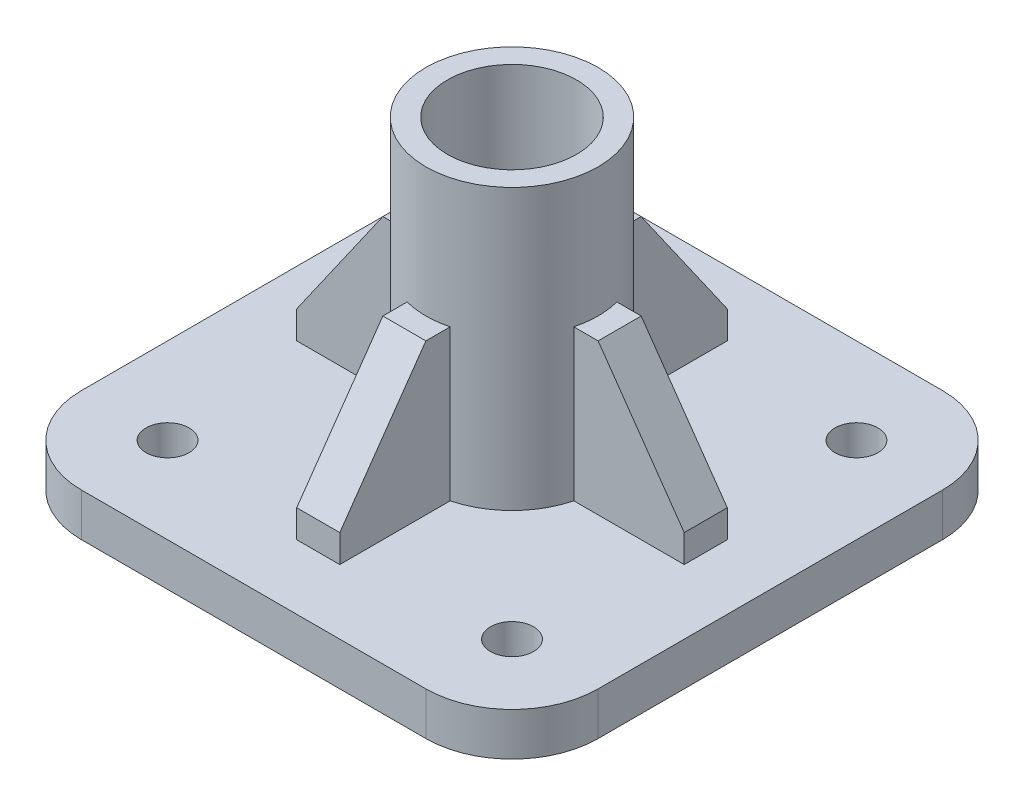
ISO-10303-21;
HEADER;
FILE_DESCRIPTION(('STEP AP214'),'2;1');
FILE_NAME('part.step','',(''),(''),'','','');
FILE_SCHEMA(('AUTOMOTIVE_DESIGN { 1 0 10303 214 1 1 1 1 }'));
ENDSEC;
DATA;
#1=APPLICATION_CONTEXT('core data for automotive mechanical design processes');
#2=APPLICATION_PROTOCOL_DEFINITION('international standard','automotive_design',2000,#1);
#3=PRODUCT_CONTEXT('',#1,'mechanical');
#4=PRODUCT('Part','Part','',(#3));
#5=PRODUCT_RELATED_PRODUCT_CATEGORY('part','',(#4));
#6=PRODUCT_DEFINITION_FORMATION('','',#4);
#7=PRODUCT_DEFINITION_CONTEXT('part definition',#1,'design');
#8=PRODUCT_DEFINITION('design','',#6,#7);
#9=PRODUCT_DEFINITION_SHAPE('','',#8);
#10=(LENGTH_UNIT() NAMED_UNIT(*) SI_UNIT(.MILLI.,.METRE.));
#11=(NAMED_UNIT(*) PLANE_ANGLE_UNIT() SI_UNIT($,.RADIAN.));
#12=(NAMED_UNIT(*) SI_UNIT($,.STERADIAN.) SOLID_ANGLE_UNIT());
#13=UNCERTAINTY_MEASURE_WITH_UNIT(LENGTH_MEASURE(1.E-05),#10,'distance_accuracy_value','');
#14=(GEOMETRIC_REPRESENTATION_CONTEXT(3) GLOBAL_UNCERTAINTY_ASSIGNED_CONTEXT((#13)) GLOBAL_UNIT_ASSIGNED_CONTEXT((#10,
#11,#12)) REPRESENTATION_CONTEXT('',''));
#15=CARTESIAN_POINT('',(0.,0.,0.));
#16=DIRECTION('',(0.,0.,1.));
#17=DIRECTION('',(1.,0.,0.));
#18=AXIS2_PLACEMENT_3D('',#15,#16,#17);
#19=CARTESIAN_POINT('',(60.,10.,-60.));
#20=DIRECTION('',(-1.,0.,0.));
#21=DIRECTION('',(0.,0.,1.));
#22=AXIS2_PLACEMENT_3D('',#19,#20,#21);
#23=PLANE('',#22);
#24=DIRECTION('',(0.,0.,-1.));
#25=VECTOR('',#24,1.);
#26=CARTESIAN_POINT('',(60.,10.,-60.));
#27=LINE('',#26,#25);
#28=CARTESIAN_POINT('',(60.,10.,40.));
#29=VERTEX_POINT('',#28);
#30=CARTESIAN_POINT('',(60.,10.,-40.));
#31=VERTEX_POINT('',#30);
#32=EDGE_CURVE('E305',#29,#31,#27,.T.);
#33=ORIENTED_EDGE('',*,*,#32,.F.);
#34=DIRECTION('',(0.,-1.,0.));
#35=VECTOR('',#34,1.);
#36=CARTESIAN_POINT('',(60.,10.,40.));
#37=LINE('',#36,#35);
#38=CARTESIAN_POINT('',(60.,0.,40.));
#39=VERTEX_POINT('',#38);
#40=EDGE_CURVE('E388',#29,#39,#37,.T.);
#41=ORIENTED_EDGE('',*,*,#40,.T.);
#42=DIRECTION('',(0.,0.,-1.));
#43=VECTOR('',#42,1.);
#44=CARTESIAN_POINT('',(60.,0.,-60.));
#45=LINE('',#44,#43);
#46=CARTESIAN_POINT('',(60.,0.,-40.));
#47=VERTEX_POINT('',#46);
#48=EDGE_CURVE('E298',#39,#47,#45,.T.);
#49=ORIENTED_EDGE('',*,*,#48,.T.);
#50=DIRECTION('',(0.,-1.,0.));
#51=VECTOR('',#50,1.);
#52=CARTESIAN_POINT('',(60.,10.,-40.));
#53=LINE('',#52,#51);
#54=EDGE_CURVE('E386',#47,#31,#53,.F.);
#55=ORIENTED_EDGE('',*,*,#54,.T.);
#56=EDGE_LOOP('',(#33,#41,#49,#55));
#57=FACE_BOUND('',#56,.T.);
#58=ADVANCED_FACE('F36',(#57),#23,.F.);
#59=CARTESIAN_POINT('',(-60.,10.,-60.));
#60=DIRECTION('',(0.,0.,1.));
#61=DIRECTION('',(1.,0.,0.));
#62=AXIS2_PLACEMENT_3D('',#59,#60,#61);
#63=PLANE('',#62);
#64=DIRECTION('',(-1.,0.,0.));
#65=VECTOR('',#64,1.);
#66=CARTESIAN_POINT('',(-60.,10.,-60.));
#67=LINE('',#66,#65);
#68=CARTESIAN_POINT('',(40.,10.,-60.));
#69=VERTEX_POINT('',#68);
#70=CARTESIAN_POINT('',(-40.,10.,-60.));
#71=VERTEX_POINT('',#70);
#72=EDGE_CURVE('E308',#69,#71,#67,.T.);
#73=ORIENTED_EDGE('',*,*,#72,.F.);
#74=DIRECTION('',(0.,-1.,0.));
#75=VECTOR('',#74,1.);
#76=CARTESIAN_POINT('',(40.,10.,-60.));
#77=LINE('',#76,#75);
#78=CARTESIAN_POINT('',(40.,0.,-60.));
#79=VERTEX_POINT('',#78);
#80=EDGE_CURVE('E413',#69,#79,#77,.T.);
#81=ORIENTED_EDGE('',*,*,#80,.T.);
#82=DIRECTION('',(-1.,0.,0.));
#83=VECTOR('',#82,1.);
#84=CARTESIAN_POINT('',(-60.,0.,-60.));
#85=LINE('',#84,#83);
#86=CARTESIAN_POINT('',(-40.,0.,-60.));
#87=VERTEX_POINT('',#86);
#88=EDGE_CURVE('E318',#79,#87,#85,.T.);
#89=ORIENTED_EDGE('',*,*,#88,.T.);
#90=DIRECTION('',(0.,-1.,0.));
#91=VECTOR('',#90,1.);
#92=CARTESIAN_POINT('',(-40.,10.,-60.));
#93=LINE('',#92,#91);
#94=EDGE_CURVE('E411',#87,#71,#93,.F.);
#95=ORIENTED_EDGE('',*,*,#94,.T.);
#96=EDGE_LOOP('',(#73,#81,#89,#95));
#97=FACE_BOUND('',#96,.T.);
#98=ADVANCED_FACE('F446',(#97),#63,.F.);
#99=CARTESIAN_POINT('',(-60.,10.,-60.));
#100=DIRECTION('',(1.,0.,0.));
#101=DIRECTION('',(0.,0.,-1.));
#102=AXIS2_PLACEMENT_3D('',#99,#100,#101);
#103=PLANE('',#102);
#104=DIRECTION('',(0.,0.,1.));
#105=VECTOR('',#104,1.);
#106=CARTESIAN_POINT('',(-60.,0.,-60.));
#107=LINE('',#106,#105);
#108=CARTESIAN_POINT('',(-60.,0.,-40.));
#109=VERTEX_POINT('',#108);
#110=CARTESIAN_POINT('',(-60.,0.,40.));
#111=VERTEX_POINT('',#110);
#112=EDGE_CURVE('E321',#109,#111,#107,.T.);
#113=ORIENTED_EDGE('',*,*,#112,.T.);
#114=DIRECTION('',(0.,-1.,0.));
#115=VECTOR('',#114,1.);
#116=CARTESIAN_POINT('',(-60.,10.,40.));
#117=LINE('',#116,#115);
#118=CARTESIAN_POINT('',(-60.,10.,40.));
#119=VERTEX_POINT('',#118);
#120=EDGE_CURVE('E11',#111,#119,#117,.F.);
#121=ORIENTED_EDGE('',*,*,#120,.T.);
#122=DIRECTION('',(0.,0.,1.));
#123=VECTOR('',#122,1.);
#124=CARTESIAN_POINT('',(-60.,10.,-60.));
#125=LINE('',#124,#123);
#126=CARTESIAN_POINT('',(-60.,10.,-40.));
#127=VERTEX_POINT('',#126);
#128=EDGE_CURVE('E311',#127,#119,#125,.T.);
#129=ORIENTED_EDGE('',*,*,#128,.F.);
#130=DIRECTION('',(0.,-1.,0.));
#131=VECTOR('',#130,1.);
#132=CARTESIAN_POINT('',(-60.,10.,-40.));
#133=LINE('',#132,#131);
#134=EDGE_CURVE('E44',#127,#109,#133,.T.);
#135=ORIENTED_EDGE('',*,*,#134,.T.);
#136=EDGE_LOOP('',(#113,#121,#129,#135));
#137=FACE_BOUND('',#136,.T.);
#138=ADVANCED_FACE('F418',(#137),#103,.F.);
#139=CARTESIAN_POINT('',(-60.,10.,60.));
#140=DIRECTION('',(0.,0.,-1.));
#141=DIRECTION('',(-1.,0.,0.));
#142=AXIS2_PLACEMENT_3D('',#139,#140,#141);
#143=PLANE('',#142);
#144=DIRECTION('',(1.,0.,0.));
#145=VECTOR('',#144,1.);
#146=CARTESIAN_POINT('',(-60.,0.,60.));
#147=LINE('',#146,#145);
#148=CARTESIAN_POINT('',(-40.,0.,60.));
#149=VERTEX_POINT('',#148);
#150=CARTESIAN_POINT('',(40.,0.,60.));
#151=VERTEX_POINT('',#150);
#152=EDGE_CURVE('E309',#149,#151,#147,.T.);
#153=ORIENTED_EDGE('',*,*,#152,.T.);
#154=DIRECTION('',(0.,-1.,0.));
#155=VECTOR('',#154,1.);
#156=CARTESIAN_POINT('',(40.,10.,60.));
#157=LINE('',#156,#155);
#158=CARTESIAN_POINT('',(40.,10.,60.));
#159=VERTEX_POINT('',#158);
#160=EDGE_CURVE('E402',#151,#159,#157,.F.);
#161=ORIENTED_EDGE('',*,*,#160,.T.);
#162=DIRECTION('',(1.,0.,0.));
#163=VECTOR('',#162,1.);
#164=CARTESIAN_POINT('',(-60.,10.,60.));
#165=LINE('',#164,#163);
#166=CARTESIAN_POINT('',(-40.,10.,60.));
#167=VERTEX_POINT('',#166);
#168=EDGE_CURVE('E313',#167,#159,#165,.T.);
#169=ORIENTED_EDGE('',*,*,#168,.F.);
#170=DIRECTION('',(0.,-1.,0.));
#171=VECTOR('',#170,1.);
#172=CARTESIAN_POINT('',(-40.,10.,60.));
#173=LINE('',#172,#171);
#174=EDGE_CURVE('E399',#167,#149,#173,.T.);
#175=ORIENTED_EDGE('',*,*,#174,.T.);
#176=EDGE_LOOP('',(#153,#161,#169,#175));
#177=FACE_BOUND('',#176,.T.);
#178=ADVANCED_FACE('F431',(#177),#143,.F.);
#179=CARTESIAN_POINT('',(60.,10.,60.));
#180=DIRECTION('',(0.,1.,0.));
#181=DIRECTION('',(0.,0.,1.));
#182=AXIS2_PLACEMENT_3D('',#179,#180,#181);
#183=PLANE('',#182);
#184=CARTESIAN_POINT('',(-40.,10.,-40.));
#185=DIRECTION('',(0.,1.,0.));
#186=DIRECTION('',(0.,0.,1.));
#187=AXIS2_PLACEMENT_3D('',#184,#185,#186);
#188=CIRCLE('',#187,5.);
#189=CARTESIAN_POINT('',(-40.,10.,-35.));
#190=VERTEX_POINT('',#189);
#191=EDGE_CURVE('E908',#190,#190,#188,.T.);
#192=ORIENTED_EDGE('',*,*,#191,.F.);
#193=EDGE_LOOP('',(#192));
#194=FACE_BOUND('',#193,.T.);
#195=CARTESIAN_POINT('',(-40.,10.,40.));
#196=DIRECTION('',(0.,1.,0.));
#197=DIRECTION('',(0.,0.,1.));
#198=AXIS2_PLACEMENT_3D('',#195,#196,#197);
#199=CIRCLE('',#198,5.);
#200=CARTESIAN_POINT('',(-40.,10.,45.));
#201=VERTEX_POINT('',#200);
#202=EDGE_CURVE('E902',#201,#201,#199,.T.);
#203=ORIENTED_EDGE('',*,*,#202,.F.);
#204=EDGE_LOOP('',(#203));
#205=FACE_BOUND('',#204,.T.);
#206=CARTESIAN_POINT('',(40.,10.,40.));
#207=DIRECTION('',(0.,1.,0.));
#208=DIRECTION('',(0.,0.,1.));
#209=AXIS2_PLACEMENT_3D('',#206,#207,#208);
#210=CIRCLE('',#209,5.);
#211=CARTESIAN_POINT('',(40.,10.,45.));
#212=VERTEX_POINT('',#211);
#213=EDGE_CURVE('E896',#212,#212,#210,.T.);
#214=ORIENTED_EDGE('',*,*,#213,.F.);
#215=EDGE_LOOP('',(#214));
#216=FACE_BOUND('',#215,.T.);
#217=CARTESIAN_POINT('',(40.,10.,-40.));
#218=DIRECTION('',(0.,1.,0.));
#219=DIRECTION('',(0.,0.,1.));
#220=AXIS2_PLACEMENT_3D('',#217,#218,#219);
#221=CIRCLE('',#220,5.);
#222=CARTESIAN_POINT('',(40.,10.,-35.));
#223=VERTEX_POINT('',#222);
#224=EDGE_CURVE('E890',#223,#223,#221,.T.);
#225=ORIENTED_EDGE('',*,*,#224,.F.);
#226=EDGE_LOOP('',(#225));
#227=FACE_BOUND('',#226,.T.);
#228=DIRECTION('',(0.,0.,1.));
#229=VECTOR('',#228,1.);
#230=CARTESIAN_POINT('',(-5.,10.,0.));
#231=LINE('',#230,#229);
#232=CARTESIAN_POINT('',(-4.99999999999984,9.99999999999999,-45.));
#233=VERTEX_POINT('',#232);
#234=CARTESIAN_POINT('',(-4.99999999999993,10.,-19.3649167310371));
#235=VERTEX_POINT('',#234);
#236=EDGE_CURVE('E266',#233,#235,#231,.T.);
#237=ORIENTED_EDGE('',*,*,#236,.F.);
#238=DIRECTION('',(1.,0.,0.));
#239=VECTOR('',#238,1.);
#240=CARTESIAN_POINT('',(-4.99999999999984,9.99999999999999,-45.));
#241=LINE('',#240,#239);
#242=CARTESIAN_POINT('',(5.00000000000016,9.99999999999999,-45.));
#243=VERTEX_POINT('',#242);
#244=EDGE_CURVE('E268',#233,#243,#241,.T.);
#245=ORIENTED_EDGE('',*,*,#244,.T.);
#246=DIRECTION('',(0.,0.,1.));
#247=VECTOR('',#246,1.);
#248=CARTESIAN_POINT('',(5.,10.,0.));
#249=LINE('',#248,#247);
#250=CARTESIAN_POINT('',(5.00000000000007,10.,-19.3649167310371));
#251=VERTEX_POINT('',#250);
#252=EDGE_CURVE('E273',#243,#251,#249,.T.);
#253=ORIENTED_EDGE('',*,*,#252,.T.);
#254=CARTESIAN_POINT('',(0.,9.99999999999999,0.));
#255=DIRECTION('',(0.,1.,0.));
#256=DIRECTION('',(0.,0.,1.));
#257=AXIS2_PLACEMENT_3D('',#254,#255,#256);
#258=CIRCLE('',#257,20.);
#259=CARTESIAN_POINT('',(19.3649167310371,10.,-5.));
#260=VERTEX_POINT('',#259);
#261=EDGE_CURVE('E249',#260,#251,#258,.T.);
#262=ORIENTED_EDGE('',*,*,#261,.F.);
#263=DIRECTION('',(-1.,0.,0.));
#264=VECTOR('',#263,1.);
#265=CARTESIAN_POINT('',(0.,10.,-5.));
#266=LINE('',#265,#264);
#267=CARTESIAN_POINT('',(45.,9.99999999999999,-5.));
#268=VERTEX_POINT('',#267);
#269=EDGE_CURVE('E225',#268,#260,#266,.T.);
#270=ORIENTED_EDGE('',*,*,#269,.F.);
#271=DIRECTION('',(0.,0.,1.));
#272=VECTOR('',#271,1.);
#273=CARTESIAN_POINT('',(45.,9.99999999999999,-5.));
#274=LINE('',#273,#272);
#275=CARTESIAN_POINT('',(45.,9.99999999999999,5.));
#276=VERTEX_POINT('',#275);
#277=EDGE_CURVE('E235',#268,#276,#274,.T.);
#278=ORIENTED_EDGE('',*,*,#277,.T.);
#279=DIRECTION('',(-1.,0.,0.));
#280=VECTOR('',#279,1.);
#281=CARTESIAN_POINT('',(0.,10.,5.));
#282=LINE('',#281,#280);
#283=CARTESIAN_POINT('',(19.3649167310371,10.,5.));
#284=VERTEX_POINT('',#283);
#285=EDGE_CURVE('E258',#276,#284,#282,.T.);
#286=ORIENTED_EDGE('',*,*,#285,.T.);
#287=CARTESIAN_POINT('',(4.9999999999998,9.99999999999999,19.3649167310371));
#288=VERTEX_POINT('',#287);
#289=EDGE_CURVE('E303',#288,#284,#258,.T.);
#290=ORIENTED_EDGE('',*,*,#289,.F.);
#291=DIRECTION('',(0.,0.,-1.));
#292=VECTOR('',#291,1.);
#293=CARTESIAN_POINT('',(5.,10.,0.));
#294=LINE('',#293,#292);
#295=CARTESIAN_POINT('',(4.99999999999953,10.,45.));
#296=VERTEX_POINT('',#295);
#297=EDGE_CURVE('E835',#296,#288,#294,.T.);
#298=ORIENTED_EDGE('',*,*,#297,.F.);
#299=DIRECTION('',(-1.,0.,0.));
#300=VECTOR('',#299,1.);
#301=CARTESIAN_POINT('',(4.99999999999953,9.99999999999999,45.));
#302=LINE('',#301,#300);
#303=CARTESIAN_POINT('',(-5.00000000000048,10.,44.9999999999999));
#304=VERTEX_POINT('',#303);
#305=EDGE_CURVE('E256',#296,#304,#302,.T.);
#306=ORIENTED_EDGE('',*,*,#305,.T.);
#307=CARTESIAN_POINT('',(-5.00000000000007,9.99999999999999,19.3649167310371));
#308=VERTEX_POINT('',#307);
#309=EDGE_CURVE('E265',#308,#304,#231,.T.);
#310=ORIENTED_EDGE('',*,*,#309,.F.);
#311=CARTESIAN_POINT('',(-19.3649167310371,10.,5.));
#312=VERTEX_POINT('',#311);
#313=EDGE_CURVE('E299',#312,#308,#258,.T.);
#314=ORIENTED_EDGE('',*,*,#313,.F.);
#315=DIRECTION('',(1.,0.,0.));
#316=VECTOR('',#315,1.);
#317=CARTESIAN_POINT('',(0.,10.,5.));
#318=LINE('',#317,#316);
#319=CARTESIAN_POINT('',(-45.,9.99999999999999,5.));
#320=VERTEX_POINT('',#319);
#321=EDGE_CURVE('E284',#320,#312,#318,.T.);
#322=ORIENTED_EDGE('',*,*,#321,.F.);
#323=DIRECTION('',(0.,0.,-1.));
#324=VECTOR('',#323,1.);
#325=CARTESIAN_POINT('',(-45.,9.99999999999999,5.));
#326=LINE('',#325,#324);
#327=CARTESIAN_POINT('',(-45.,9.99999999999999,-5.));
#328=VERTEX_POINT('',#327);
#329=EDGE_CURVE('E286',#320,#328,#326,.T.);
#330=ORIENTED_EDGE('',*,*,#329,.T.);
#331=DIRECTION('',(1.,0.,0.));
#332=VECTOR('',#331,1.);
#333=CARTESIAN_POINT('',(0.,10.,-5.));
#334=LINE('',#333,#332);
#335=CARTESIAN_POINT('',(-19.3649167310371,10.,-5.));
#336=VERTEX_POINT('',#335);
#337=EDGE_CURVE('E282',#328,#336,#334,.T.);
#338=ORIENTED_EDGE('',*,*,#337,.T.);
#339=EDGE_CURVE('E304',#235,#336,#258,.T.);
#340=ORIENTED_EDGE('',*,*,#339,.F.);
#341=EDGE_LOOP('',(#237,#245,#253,#262,#270,#278,#286,#290,#298,#306,#310,#314,#322,#330,#338,#340));
#342=FACE_BOUND('',#341,.T.);
#343=ORIENTED_EDGE('',*,*,#168,.T.);
#344=CARTESIAN_POINT('',(40.,10.,40.));
#345=DIRECTION('',(0.,1.,0.));
#346=DIRECTION('',(0.,0.,1.));
#347=AXIS2_PLACEMENT_3D('',#344,#345,#346);
#348=CIRCLE('',#347,20.);
#349=EDGE_CURVE('E409',#159,#29,#348,.T.);
#350=ORIENTED_EDGE('',*,*,#349,.T.);
#351=ORIENTED_EDGE('',*,*,#32,.T.);
#352=CARTESIAN_POINT('',(40.,10.,-40.));
#353=DIRECTION('',(0.,1.,0.));
#354=DIRECTION('',(0.,0.,1.));
#355=AXIS2_PLACEMENT_3D('',#352,#353,#354);
#356=CIRCLE('',#355,20.);
#357=EDGE_CURVE('E407',#31,#69,#356,.T.);
#358=ORIENTED_EDGE('',*,*,#357,.T.);
#359=ORIENTED_EDGE('',*,*,#72,.T.);
#360=CARTESIAN_POINT('',(-40.,10.,-40.));
#361=DIRECTION('',(0.,1.,0.));
#362=DIRECTION('',(0.,0.,1.));
#363=AXIS2_PLACEMENT_3D('',#360,#361,#362);
#364=CIRCLE('',#363,20.);
#365=EDGE_CURVE('E56',#71,#127,#364,.T.);
#366=ORIENTED_EDGE('',*,*,#365,.T.);
#367=ORIENTED_EDGE('',*,*,#128,.T.);
#368=CARTESIAN_POINT('',(-40.,10.,40.));
#369=DIRECTION('',(0.,1.,0.));
#370=DIRECTION('',(0.,0.,1.));
#371=AXIS2_PLACEMENT_3D('',#368,#369,#370);
#372=CIRCLE('',#371,20.);
#373=EDGE_CURVE('E405',#119,#167,#372,.T.);
#374=ORIENTED_EDGE('',*,*,#373,.T.);
#375=EDGE_LOOP('',(#343,#350,#351,#358,#359,#366,#367,#374));
#376=FACE_BOUND('',#375,.T.);
#377=ADVANCED_FACE('F246',(#194,#205,#216,#227,#342,#376),#183,.T.);
#378=CARTESIAN_POINT('',(60.,0.,60.));
#379=DIRECTION('',(0.,1.,0.));
#380=DIRECTION('',(0.,0.,1.));
#381=AXIS2_PLACEMENT_3D('',#378,#379,#380);
#382=PLANE('',#381);
#383=CARTESIAN_POINT('',(-40.,0.,-40.));
#384=DIRECTION('',(0.,1.,0.));
#385=DIRECTION('',(0.,0.,1.));
#386=AXIS2_PLACEMENT_3D('',#383,#384,#385);
#387=CIRCLE('',#386,5.);
#388=CARTESIAN_POINT('',(-40.,0.,-35.));
#389=VERTEX_POINT('',#388);
#390=EDGE_CURVE('E905',#389,#389,#387,.T.);
#391=ORIENTED_EDGE('',*,*,#390,.T.);
#392=EDGE_LOOP('',(#391));
#393=FACE_BOUND('',#392,.T.);
#394=CARTESIAN_POINT('',(-40.,0.,40.));
#395=DIRECTION('',(0.,1.,0.));
#396=DIRECTION('',(0.,0.,1.));
#397=AXIS2_PLACEMENT_3D('',#394,#395,#396);
#398=CIRCLE('',#397,5.);
#399=CARTESIAN_POINT('',(-40.,0.,45.));
#400=VERTEX_POINT('',#399);
#401=EDGE_CURVE('E899',#400,#400,#398,.T.);
#402=ORIENTED_EDGE('',*,*,#401,.T.);
#403=EDGE_LOOP('',(#402));
#404=FACE_BOUND('',#403,.T.);
#405=CARTESIAN_POINT('',(40.,0.,40.));
#406=DIRECTION('',(0.,1.,0.));
#407=DIRECTION('',(0.,0.,1.));
#408=AXIS2_PLACEMENT_3D('',#405,#406,#407);
#409=CIRCLE('',#408,5.);
#410=CARTESIAN_POINT('',(40.,0.,45.));
#411=VERTEX_POINT('',#410);
#412=EDGE_CURVE('E893',#411,#411,#409,.T.);
#413=ORIENTED_EDGE('',*,*,#412,.T.);
#414=EDGE_LOOP('',(#413));
#415=FACE_BOUND('',#414,.T.);
#416=CARTESIAN_POINT('',(40.,0.,-40.));
#417=DIRECTION('',(0.,1.,0.));
#418=DIRECTION('',(0.,0.,1.));
#419=AXIS2_PLACEMENT_3D('',#416,#417,#418);
#420=CIRCLE('',#419,5.);
#421=CARTESIAN_POINT('',(40.,0.,-35.));
#422=VERTEX_POINT('',#421);
#423=EDGE_CURVE('E886',#422,#422,#420,.T.);
#424=ORIENTED_EDGE('',*,*,#423,.T.);
#425=EDGE_LOOP('',(#424));
#426=FACE_BOUND('',#425,.T.);
#427=CARTESIAN_POINT('',(0.,0.,0.));
#428=DIRECTION('',(0.,1.,0.));
#429=DIRECTION('',(0.,0.,1.));
#430=AXIS2_PLACEMENT_3D('',#427,#428,#429);
#431=CIRCLE('',#430,15.);
#432=CARTESIAN_POINT('',(0.,0.,15.));
#433=VERTEX_POINT('',#432);
#434=EDGE_CURVE('E843',#433,#433,#431,.T.);
#435=ORIENTED_EDGE('',*,*,#434,.T.);
#436=EDGE_LOOP('',(#435));
#437=FACE_BOUND('',#436,.T.);
#438=ORIENTED_EDGE('',*,*,#48,.F.);
#439=CARTESIAN_POINT('',(40.,0.,40.));
#440=DIRECTION('',(0.,1.,0.));
#441=DIRECTION('',(0.,0.,1.));
#442=AXIS2_PLACEMENT_3D('',#439,#440,#441);
#443=CIRCLE('',#442,20.);
#444=EDGE_CURVE('E397',#39,#151,#443,.F.);
#445=ORIENTED_EDGE('',*,*,#444,.T.);
#446=ORIENTED_EDGE('',*,*,#152,.F.);
#447=CARTESIAN_POINT('',(-40.,0.,40.));
#448=DIRECTION('',(0.,1.,0.));
#449=DIRECTION('',(0.,0.,1.));
#450=AXIS2_PLACEMENT_3D('',#447,#448,#449);
#451=CIRCLE('',#450,20.);
#452=EDGE_CURVE('E393',#149,#111,#451,.F.);
#453=ORIENTED_EDGE('',*,*,#452,.T.);
#454=ORIENTED_EDGE('',*,*,#112,.F.);
#455=CARTESIAN_POINT('',(-40.,0.,-40.));
#456=DIRECTION('',(0.,1.,0.));
#457=DIRECTION('',(0.,0.,1.));
#458=AXIS2_PLACEMENT_3D('',#455,#456,#457);
#459=CIRCLE('',#458,20.);
#460=EDGE_CURVE('E391',#109,#87,#459,.F.);
#461=ORIENTED_EDGE('',*,*,#460,.T.);
#462=ORIENTED_EDGE('',*,*,#88,.F.);
#463=CARTESIAN_POINT('',(40.,0.,-40.));
#464=DIRECTION('',(0.,1.,0.));
#465=DIRECTION('',(0.,0.,1.));
#466=AXIS2_PLACEMENT_3D('',#463,#464,#465);
#467=CIRCLE('',#466,20.);
#468=EDGE_CURVE('E395',#79,#47,#467,.F.);
#469=ORIENTED_EDGE('',*,*,#468,.T.);
#470=EDGE_LOOP('',(#438,#445,#446,#453,#454,#461,#462,#469));
#471=FACE_BOUND('',#470,.T.);
#472=ADVANCED_FACE('F422',(#393,#404,#415,#426,#437,#471),#382,.F.);
#473=CARTESIAN_POINT('',(0.,75.,0.));
#474=DIRECTION('',(0.,-1.,0.));
#475=DIRECTION('',(0.,0.,-1.));
#476=AXIS2_PLACEMENT_3D('',#473,#474,#475);
#477=CYLINDRICAL_SURFACE('',#476,20.);
#478=DIRECTION('',(0.,-1.,0.));
#479=VECTOR('',#478,1.);
#480=CARTESIAN_POINT('',(-4.99999999999993,75.,-19.3649167310371));
#481=LINE('',#480,#479);
#482=CARTESIAN_POINT('',(-4.99999999999993,45.,-19.3649167310371));
#483=VERTEX_POINT('',#482);
#484=EDGE_CURVE('E359',#235,#483,#481,.F.);
#485=ORIENTED_EDGE('',*,*,#484,.F.);
#486=ORIENTED_EDGE('',*,*,#339,.T.);
#487=DIRECTION('',(0.,-1.,0.));
#488=VECTOR('',#487,1.);
#489=CARTESIAN_POINT('',(-19.3649167310371,75.,-5.));
#490=LINE('',#489,#488);
#491=CARTESIAN_POINT('',(-19.3649167310371,45.,-5.));
#492=VERTEX_POINT('',#491);
#493=EDGE_CURVE('E302',#336,#492,#490,.F.);
#494=ORIENTED_EDGE('',*,*,#493,.T.);
#495=CARTESIAN_POINT('',(0.,45.,0.));
#496=DIRECTION('',(0.,-1.,0.));
#497=DIRECTION('',(0.,0.,-1.));
#498=AXIS2_PLACEMENT_3D('',#495,#496,#497);
#499=CIRCLE('',#498,20.);
#500=CARTESIAN_POINT('',(-19.3649167310371,45.,5.));
#501=VERTEX_POINT('',#500);
#502=EDGE_CURVE('E327',#492,#501,#499,.F.);
#503=ORIENTED_EDGE('',*,*,#502,.T.);
#504=DIRECTION('',(0.,-1.,0.));
#505=VECTOR('',#504,1.);
#506=CARTESIAN_POINT('',(-19.3649167310371,75.,5.));
#507=LINE('',#506,#505);
#508=EDGE_CURVE('E330',#312,#501,#507,.F.);
#509=ORIENTED_EDGE('',*,*,#508,.F.);
#510=ORIENTED_EDGE('',*,*,#313,.T.);
#511=DIRECTION('',(0.,-1.,0.));
#512=VECTOR('',#511,1.);
#513=CARTESIAN_POINT('',(-5.00000000000007,75.,19.3649167310371));
#514=LINE('',#513,#512);
#515=CARTESIAN_POINT('',(-5.00000000000007,45.,19.3649167310371));
#516=VERTEX_POINT('',#515);
#517=EDGE_CURVE('E346',#516,#308,#514,.T.);
#518=ORIENTED_EDGE('',*,*,#517,.F.);
#519=CARTESIAN_POINT('',(0.,45.,0.));
#520=DIRECTION('',(0.,-1.,0.));
#521=DIRECTION('',(0.,0.,-1.));
#522=AXIS2_PLACEMENT_3D('',#519,#520,#521);
#523=CIRCLE('',#522,20.);
#524=CARTESIAN_POINT('',(4.9999999999998,45.,19.3649167310371));
#525=VERTEX_POINT('',#524);
#526=EDGE_CURVE('E344',#516,#525,#523,.F.);
#527=ORIENTED_EDGE('',*,*,#526,.T.);
#528=DIRECTION('',(0.,-1.,0.));
#529=VECTOR('',#528,1.);
#530=CARTESIAN_POINT('',(4.9999999999998,75.,19.3649167310371));
#531=LINE('',#530,#529);
#532=EDGE_CURVE('E341',#288,#525,#531,.F.);
#533=ORIENTED_EDGE('',*,*,#532,.F.);
#534=ORIENTED_EDGE('',*,*,#289,.T.);
#535=DIRECTION('',(0.,-1.,0.));
#536=VECTOR('',#535,1.);
#537=CARTESIAN_POINT('',(19.3649167310371,75.,5.));
#538=LINE('',#537,#536);
#539=CARTESIAN_POINT('',(19.3649167310371,45.,5.));
#540=VERTEX_POINT('',#539);
#541=EDGE_CURVE('E351',#284,#540,#538,.F.);
#542=ORIENTED_EDGE('',*,*,#541,.T.);
#543=CARTESIAN_POINT('',(19.3649167310371,45.,-5.));
#544=VERTEX_POINT('',#543);
#545=EDGE_CURVE('E348',#540,#544,#523,.F.);
#546=ORIENTED_EDGE('',*,*,#545,.T.);
#547=DIRECTION('',(0.,-1.,0.));
#548=VECTOR('',#547,1.);
#549=CARTESIAN_POINT('',(19.3649167310371,75.,-5.));
#550=LINE('',#549,#548);
#551=EDGE_CURVE('E354',#260,#544,#550,.F.);
#552=ORIENTED_EDGE('',*,*,#551,.F.);
#553=ORIENTED_EDGE('',*,*,#261,.T.);
#554=DIRECTION('',(0.,-1.,0.));
#555=VECTOR('',#554,1.);
#556=CARTESIAN_POINT('',(5.00000000000007,75.,-19.3649167310371));
#557=LINE('',#556,#555);
#558=CARTESIAN_POINT('',(5.00000000000007,45.,-19.3649167310371));
#559=VERTEX_POINT('',#558);
#560=EDGE_CURVE('E356',#251,#559,#557,.F.);
#561=ORIENTED_EDGE('',*,*,#560,.T.);
#562=EDGE_CURVE('E347',#559,#483,#523,.F.);
#563=ORIENTED_EDGE('',*,*,#562,.T.);
#564=EDGE_LOOP('',(#485,#486,#494,#503,#509,#510,#518,#527,#533,#534,#542,#546,#552,#553,#561,#563));
#565=FACE_BOUND('',#564,.T.);
#566=CARTESIAN_POINT('',(0.,75.,0.));
#567=DIRECTION('',(0.,-1.,0.));
#568=DIRECTION('',(0.,0.,-1.));
#569=AXIS2_PLACEMENT_3D('',#566,#567,#568);
#570=CIRCLE('',#569,20.);
#571=CARTESIAN_POINT('',(0.,75.,-20.));
#572=VERTEX_POINT('',#571);
#573=EDGE_CURVE('E295',#572,#572,#570,.T.);
#574=ORIENTED_EDGE('',*,*,#573,.T.);
#575=EDGE_LOOP('',(#574));
#576=FACE_BOUND('',#575,.T.);
#577=ADVANCED_FACE('F522',(#565,#576),#477,.T.);
#578=CARTESIAN_POINT('',(0.,75.,0.));
#579=DIRECTION('',(0.,-1.,0.));
#580=DIRECTION('',(0.,0.,-1.));
#581=AXIS2_PLACEMENT_3D('',#578,#579,#580);
#582=PLANE('',#581);
#583=CARTESIAN_POINT('',(0.,75.,0.));
#584=DIRECTION('',(0.,1.,0.));
#585=DIRECTION('',(0.,0.,1.));
#586=AXIS2_PLACEMENT_3D('',#583,#584,#585);
#587=CIRCLE('',#586,15.);
#588=CARTESIAN_POINT('',(0.,75.,15.));
#589=VERTEX_POINT('',#588);
#590=EDGE_CURVE('E881',#589,#589,#587,.T.);
#591=ORIENTED_EDGE('',*,*,#590,.F.);
#592=EDGE_LOOP('',(#591));
#593=FACE_BOUND('',#592,.T.);
#594=ORIENTED_EDGE('',*,*,#573,.F.);
#595=EDGE_LOOP('',(#594));
#596=FACE_BOUND('',#595,.T.);
#597=ADVANCED_FACE('F615',(#593,#596),#582,.F.);
#598=CARTESIAN_POINT('',(0.,45.,5.));
#599=DIRECTION('',(0.,-1.,0.));
#600=DIRECTION('',(0.,0.,-1.));
#601=AXIS2_PLACEMENT_3D('',#598,#599,#600);
#602=PLANE('',#601);
#603=DIRECTION('',(-1.,0.,0.));
#604=VECTOR('',#603,1.);
#605=CARTESIAN_POINT('',(0.,45.,-5.));
#606=LINE('',#605,#604);
#607=CARTESIAN_POINT('',(-24.9999999999999,45.,-5.));
#608=VERTEX_POINT('',#607);
#609=EDGE_CURVE('E277',#492,#608,#606,.T.);
#610=ORIENTED_EDGE('',*,*,#609,.T.);
#611=DIRECTION('',(0.,0.,1.));
#612=VECTOR('',#611,1.);
#613=CARTESIAN_POINT('',(-25.,45.,5.));
#614=LINE('',#613,#612);
#615=CARTESIAN_POINT('',(-25.,45.,5.));
#616=VERTEX_POINT('',#615);
#617=EDGE_CURVE('E337',#608,#616,#614,.T.);
#618=ORIENTED_EDGE('',*,*,#617,.T.);
#619=DIRECTION('',(-1.,0.,0.));
#620=VECTOR('',#619,1.);
#621=CARTESIAN_POINT('',(0.,45.,5.));
#622=LINE('',#621,#620);
#623=EDGE_CURVE('E278',#501,#616,#622,.T.);
#624=ORIENTED_EDGE('',*,*,#623,.F.);
#625=ORIENTED_EDGE('',*,*,#502,.F.);
#626=EDGE_LOOP('',(#610,#618,#624,#625));
#627=FACE_BOUND('',#626,.T.);
#628=ADVANCED_FACE('F611',(#627),#602,.F.);
#629=CARTESIAN_POINT('',(-45.,9.99999999999999,5.));
#630=DIRECTION('',(1.,0.,0.));
#631=DIRECTION('',(0.,0.,-1.));
#632=AXIS2_PLACEMENT_3D('',#629,#630,#631);
#633=PLANE('',#632);
#634=DIRECTION('',(0.,-1.,0.));
#635=VECTOR('',#634,1.);
#636=CARTESIAN_POINT('',(-45.,9.99999999999999,5.));
#637=LINE('',#636,#635);
#638=CARTESIAN_POINT('',(-45.,16.4370398651577,5.));
#639=VERTEX_POINT('',#638);
#640=EDGE_CURVE('E281',#639,#320,#637,.T.);
#641=ORIENTED_EDGE('',*,*,#640,.F.);
#642=DIRECTION('',(0.,0.,-1.));
#643=VECTOR('',#642,1.);
#644=CARTESIAN_POINT('',(-45.,16.4370398651578,5.));
#645=LINE('',#644,#643);
#646=CARTESIAN_POINT('',(-45.,16.4370398651577,-5.));
#647=VERTEX_POINT('',#646);
#648=EDGE_CURVE('E332',#639,#647,#645,.T.);
#649=ORIENTED_EDGE('',*,*,#648,.T.);
#650=DIRECTION('',(0.,-1.,0.));
#651=VECTOR('',#650,1.);
#652=CARTESIAN_POINT('',(-45.,9.99999999999999,-5.));
#653=LINE('',#652,#651);
#654=EDGE_CURVE('E289',#647,#328,#653,.T.);
#655=ORIENTED_EDGE('',*,*,#654,.T.);
#656=ORIENTED_EDGE('',*,*,#329,.F.);
#657=EDGE_LOOP('',(#641,#649,#655,#656));
#658=FACE_BOUND('',#657,.T.);
#659=ADVANCED_FACE('F604',(#658),#633,.F.);
#660=CARTESIAN_POINT('',(0.,45.,5.));
#661=DIRECTION('',(0.,0.,1.));
#662=DIRECTION('',(1.,0.,0.));
#663=AXIS2_PLACEMENT_3D('',#660,#661,#662);
#664=PLANE('',#663);
#665=ORIENTED_EDGE('',*,*,#623,.T.);
#666=DIRECTION('',(0.573576436351048,0.819152044288991,0.));
#667=VECTOR('',#666,1.);
#668=CARTESIAN_POINT('',(-16.7752517915708,56.7461577598238,5.));
#669=LINE('',#668,#667);
#670=EDGE_CURVE('E339',#616,#639,#669,.F.);
#671=ORIENTED_EDGE('',*,*,#670,.T.);
#672=ORIENTED_EDGE('',*,*,#640,.T.);
#673=ORIENTED_EDGE('',*,*,#321,.T.);
#674=ORIENTED_EDGE('',*,*,#508,.T.);
#675=EDGE_LOOP('',(#665,#671,#672,#673,#674));
#676=FACE_BOUND('',#675,.T.);
#677=ADVANCED_FACE('F601',(#676),#664,.T.);
#678=CARTESIAN_POINT('',(0.,45.,-5.));
#679=DIRECTION('',(0.,0.,1.));
#680=DIRECTION('',(1.,0.,0.));
#681=AXIS2_PLACEMENT_3D('',#678,#679,#680);
#682=PLANE('',#681);
#683=ORIENTED_EDGE('',*,*,#654,.F.);
#684=DIRECTION('',(-0.573576436351048,-0.819152044288991,0.));
#685=VECTOR('',#684,1.);
#686=CARTESIAN_POINT('',(-45.,16.4370398651578,-5.));
#687=LINE('',#686,#685);
#688=EDGE_CURVE('E335',#647,#608,#687,.F.);
#689=ORIENTED_EDGE('',*,*,#688,.T.);
#690=ORIENTED_EDGE('',*,*,#609,.F.);
#691=ORIENTED_EDGE('',*,*,#493,.F.);
#692=ORIENTED_EDGE('',*,*,#337,.F.);
#693=EDGE_LOOP('',(#683,#689,#690,#691,#692));
#694=FACE_BOUND('',#693,.T.);
#695=ADVANCED_FACE('F469',(#694),#682,.F.);
#696=CARTESIAN_POINT('',(-45.,16.4370398651578,5.));
#697=DIRECTION('',(0.819152044288991,-0.573576436351047,0.));
#698=DIRECTION('',(0.573576436351048,0.819152044288991,0.));
#699=AXIS2_PLACEMENT_3D('',#696,#697,#698);
#700=PLANE('',#699);
#701=ORIENTED_EDGE('',*,*,#670,.F.);
#702=ORIENTED_EDGE('',*,*,#617,.F.);
#703=ORIENTED_EDGE('',*,*,#688,.F.);
#704=ORIENTED_EDGE('',*,*,#648,.F.);
#705=EDGE_LOOP('',(#701,#702,#703,#704));
#706=FACE_BOUND('',#705,.T.);
#707=ADVANCED_FACE('F465',(#706),#700,.F.);
#708=CARTESIAN_POINT('',(5.,45.,0.));
#709=DIRECTION('',(1.,0.,0.));
#710=DIRECTION('',(0.,0.,-1.));
#711=AXIS2_PLACEMENT_3D('',#708,#709,#710);
#712=PLANE('',#711);
#713=DIRECTION('',(0.,0.,1.));
#714=VECTOR('',#713,1.);
#715=CARTESIAN_POINT('',(5.,45.,0.));
#716=LINE('',#715,#714);
#717=CARTESIAN_POINT('',(4.99999999999974,45.,25.));
#718=VERTEX_POINT('',#717);
#719=EDGE_CURVE('E831',#525,#718,#716,.T.);
#720=ORIENTED_EDGE('',*,*,#719,.T.);
#721=DIRECTION('',(0.,0.819152044288991,-0.573576436351048));
#722=VECTOR('',#721,1.);
#723=CARTESIAN_POINT('',(4.99999999999982,56.7461577598238,16.7752517915708));
#724=LINE('',#723,#722);
#725=CARTESIAN_POINT('',(4.99999999999953,16.4370398651577,45.0000000000001));
#726=VERTEX_POINT('',#725);
#727=EDGE_CURVE('E384',#718,#726,#724,.F.);
#728=ORIENTED_EDGE('',*,*,#727,.T.);
#729=DIRECTION('',(0.,-1.,0.));
#730=VECTOR('',#729,1.);
#731=CARTESIAN_POINT('',(4.99999999999953,9.99999999999999,45.));
#732=LINE('',#731,#730);
#733=EDGE_CURVE('E829',#726,#296,#732,.T.);
#734=ORIENTED_EDGE('',*,*,#733,.T.);
#735=ORIENTED_EDGE('',*,*,#297,.T.);
#736=ORIENTED_EDGE('',*,*,#532,.T.);
#737=EDGE_LOOP('',(#720,#728,#734,#735,#736));
#738=FACE_BOUND('',#737,.T.);
#739=ADVANCED_FACE('F468',(#738),#712,.T.);
#740=CARTESIAN_POINT('',(-5.,45.,0.));
#741=DIRECTION('',(-1.,0.,0.));
#742=DIRECTION('',(0.,0.,1.));
#743=AXIS2_PLACEMENT_3D('',#740,#741,#742);
#744=PLANE('',#743);
#745=DIRECTION('',(0.,-1.,0.));
#746=VECTOR('',#745,1.);
#747=CARTESIAN_POINT('',(-5.00000000000047,9.99999999999999,44.9999999999999));
#748=LINE('',#747,#746);
#749=CARTESIAN_POINT('',(-5.00000000000032,16.4370398651577,45.));
#750=VERTEX_POINT('',#749);
#751=EDGE_CURVE('E838',#750,#304,#748,.T.);
#752=ORIENTED_EDGE('',*,*,#751,.F.);
#753=DIRECTION('',(0.,-0.819152044288991,0.573576436351048));
#754=VECTOR('',#753,1.);
#755=CARTESIAN_POINT('',(-5.00000000000006,56.7461577598238,16.7752517915707));
#756=LINE('',#755,#754);
#757=CARTESIAN_POINT('',(-5.00000000000009,45.,24.9999999999999));
#758=VERTEX_POINT('',#757);
#759=EDGE_CURVE('E380',#750,#758,#756,.F.);
#760=ORIENTED_EDGE('',*,*,#759,.T.);
#761=DIRECTION('',(0.,0.,-1.));
#762=VECTOR('',#761,1.);
#763=CARTESIAN_POINT('',(-5.,45.,0.));
#764=LINE('',#763,#762);
#765=EDGE_CURVE('E260',#758,#516,#764,.T.);
#766=ORIENTED_EDGE('',*,*,#765,.T.);
#767=ORIENTED_EDGE('',*,*,#517,.T.);
#768=ORIENTED_EDGE('',*,*,#309,.T.);
#769=EDGE_LOOP('',(#752,#760,#766,#767,#768));
#770=FACE_BOUND('',#769,.T.);
#771=ADVANCED_FACE('F570',(#770),#744,.T.);
#772=CARTESIAN_POINT('',(-5.,45.,0.));
#773=DIRECTION('',(0.,-1.,0.));
#774=DIRECTION('',(0.,0.,-1.));
#775=AXIS2_PLACEMENT_3D('',#772,#773,#774);
#776=PLANE('',#775);
#777=ORIENTED_EDGE('',*,*,#765,.F.);
#778=DIRECTION('',(1.,0.,0.));
#779=VECTOR('',#778,1.);
#780=CARTESIAN_POINT('',(-5.00000000000026,45.,24.9999999999999));
#781=LINE('',#780,#779);
#782=EDGE_CURVE('E382',#758,#718,#781,.T.);
#783=ORIENTED_EDGE('',*,*,#782,.T.);
#784=ORIENTED_EDGE('',*,*,#719,.F.);
#785=ORIENTED_EDGE('',*,*,#526,.F.);
#786=EDGE_LOOP('',(#777,#783,#784,#785));
#787=FACE_BOUND('',#786,.T.);
#788=ADVANCED_FACE('F575',(#787),#776,.F.);
#789=CARTESIAN_POINT('',(4.99999999999953,9.99999999999999,45.));
#790=DIRECTION('',(0.,0.,-1.));
#791=DIRECTION('',(-1.,0.,0.));
#792=AXIS2_PLACEMENT_3D('',#789,#790,#791);
#793=PLANE('',#792);
#794=ORIENTED_EDGE('',*,*,#733,.F.);
#795=DIRECTION('',(-1.,0.,0.));
#796=VECTOR('',#795,1.);
#797=CARTESIAN_POINT('',(4.99999999999953,16.4370398651578,45.));
#798=LINE('',#797,#796);
#799=EDGE_CURVE('E377',#726,#750,#798,.T.);
#800=ORIENTED_EDGE('',*,*,#799,.T.);
#801=ORIENTED_EDGE('',*,*,#751,.T.);
#802=ORIENTED_EDGE('',*,*,#305,.F.);
#803=EDGE_LOOP('',(#794,#800,#801,#802));
#804=FACE_BOUND('',#803,.T.);
#805=ADVANCED_FACE('F572',(#804),#793,.F.);
#806=CARTESIAN_POINT('',(0.,45.,-5.));
#807=DIRECTION('',(0.,0.,-1.));
#808=DIRECTION('',(-1.,0.,0.));
#809=AXIS2_PLACEMENT_3D('',#806,#807,#808);
#810=PLANE('',#809);
#811=DIRECTION('',(1.,0.,0.));
#812=VECTOR('',#811,1.);
#813=CARTESIAN_POINT('',(0.,45.,-5.));
#814=LINE('',#813,#812);
#815=CARTESIAN_POINT('',(25.,45.,-5.));
#816=VERTEX_POINT('',#815);
#817=EDGE_CURVE('E232',#544,#816,#814,.T.);
#818=ORIENTED_EDGE('',*,*,#817,.T.);
#819=DIRECTION('',(-0.573576436351048,0.819152044288991,0.));
#820=VECTOR('',#819,1.);
#821=CARTESIAN_POINT('',(16.7752517915708,56.7461577598238,-5.));
#822=LINE('',#821,#820);
#823=CARTESIAN_POINT('',(45.,16.4370398651577,-5.));
#824=VERTEX_POINT('',#823);
#825=EDGE_CURVE('E228',#816,#824,#822,.F.);
#826=ORIENTED_EDGE('',*,*,#825,.T.);
#827=DIRECTION('',(0.,-1.,0.));
#828=VECTOR('',#827,1.);
#829=CARTESIAN_POINT('',(45.,9.99999999999999,-5.));
#830=LINE('',#829,#828);
#831=EDGE_CURVE('E220',#824,#268,#830,.T.);
#832=ORIENTED_EDGE('',*,*,#831,.T.);
#833=ORIENTED_EDGE('',*,*,#269,.T.);
#834=ORIENTED_EDGE('',*,*,#551,.T.);
#835=EDGE_LOOP('',(#818,#826,#832,#833,#834));
#836=FACE_BOUND('',#835,.T.);
#837=ADVANCED_FACE('F223',(#836),#810,.T.);
#838=CARTESIAN_POINT('',(0.,45.,5.));
#839=DIRECTION('',(0.,0.,-1.));
#840=DIRECTION('',(-1.,0.,0.));
#841=AXIS2_PLACEMENT_3D('',#838,#839,#840);
#842=PLANE('',#841);
#843=DIRECTION('',(0.,-1.,0.));
#844=VECTOR('',#843,1.);
#845=CARTESIAN_POINT('',(45.,9.99999999999999,5.));
#846=LINE('',#845,#844);
#847=CARTESIAN_POINT('',(45.,16.4370398651577,5.));
#848=VERTEX_POINT('',#847);
#849=EDGE_CURVE('E238',#848,#276,#846,.T.);
#850=ORIENTED_EDGE('',*,*,#849,.F.);
#851=DIRECTION('',(0.573576436351048,-0.819152044288991,0.));
#852=VECTOR('',#851,1.);
#853=CARTESIAN_POINT('',(45.,16.4370398651578,5.));
#854=LINE('',#853,#852);
#855=CARTESIAN_POINT('',(24.9999999999999,45.,5.));
#856=VERTEX_POINT('',#855);
#857=EDGE_CURVE('E372',#848,#856,#854,.F.);
#858=ORIENTED_EDGE('',*,*,#857,.T.);
#859=DIRECTION('',(1.,0.,0.));
#860=VECTOR('',#859,1.);
#861=CARTESIAN_POINT('',(0.,45.,5.));
#862=LINE('',#861,#860);
#863=EDGE_CURVE('E253',#540,#856,#862,.T.);
#864=ORIENTED_EDGE('',*,*,#863,.F.);
#865=ORIENTED_EDGE('',*,*,#541,.F.);
#866=ORIENTED_EDGE('',*,*,#285,.F.);
#867=EDGE_LOOP('',(#850,#858,#864,#865,#866));
#868=FACE_BOUND('',#867,.T.);
#869=ADVANCED_FACE('F579',(#868),#842,.F.);
#870=ORIENTED_EDGE('',*,*,#863,.T.);
#871=DIRECTION('',(0.,0.,-1.));
#872=VECTOR('',#871,1.);
#873=CARTESIAN_POINT('',(25.,45.,0.));
#874=LINE('',#873,#872);
#875=EDGE_CURVE('E374',#856,#816,#874,.T.);
#876=ORIENTED_EDGE('',*,*,#875,.T.);
#877=ORIENTED_EDGE('',*,*,#817,.F.);
#878=ORIENTED_EDGE('',*,*,#545,.F.);
#879=EDGE_LOOP('',(#870,#876,#877,#878));
#880=FACE_BOUND('',#879,.T.);
#881=ADVANCED_FACE('F582',(#880),#776,.F.);
#882=CARTESIAN_POINT('',(45.,9.99999999999999,-5.));
#883=DIRECTION('',(-1.,0.,0.));
#884=DIRECTION('',(0.,0.,1.));
#885=AXIS2_PLACEMENT_3D('',#882,#883,#884);
#886=PLANE('',#885);
#887=ORIENTED_EDGE('',*,*,#831,.F.);
#888=DIRECTION('',(0.,0.,1.));
#889=VECTOR('',#888,1.);
#890=CARTESIAN_POINT('',(45.,16.4370398651578,-5.));
#891=LINE('',#890,#889);
#892=EDGE_CURVE('E370',#824,#848,#891,.T.);
#893=ORIENTED_EDGE('',*,*,#892,.T.);
#894=ORIENTED_EDGE('',*,*,#849,.T.);
#895=ORIENTED_EDGE('',*,*,#277,.F.);
#896=EDGE_LOOP('',(#887,#893,#894,#895));
#897=FACE_BOUND('',#896,.T.);
#898=ADVANCED_FACE('F236',(#897),#886,.F.);
#899=CARTESIAN_POINT('',(-4.99999999999991,45.,-25.));
#900=VERTEX_POINT('',#899);
#901=EDGE_CURVE('E263',#483,#900,#764,.T.);
#902=ORIENTED_EDGE('',*,*,#901,.T.);
#903=DIRECTION('',(0.,0.819152044288991,0.573576436351048));
#904=VECTOR('',#903,1.);
#905=CARTESIAN_POINT('',(-4.99999999999994,56.7461577598238,-16.7752517915708));
#906=LINE('',#905,#904);
#907=CARTESIAN_POINT('',(-4.99999999999984,16.4370398651577,-45.));
#908=VERTEX_POINT('',#907);
#909=EDGE_CURVE('E368',#900,#908,#906,.F.);
#910=ORIENTED_EDGE('',*,*,#909,.T.);
#911=DIRECTION('',(0.,-1.,0.));
#912=VECTOR('',#911,1.);
#913=CARTESIAN_POINT('',(-4.99999999999984,9.99999999999999,-45.));
#914=LINE('',#913,#912);
#915=EDGE_CURVE('E262',#908,#233,#914,.T.);
#916=ORIENTED_EDGE('',*,*,#915,.T.);
#917=ORIENTED_EDGE('',*,*,#236,.T.);
#918=ORIENTED_EDGE('',*,*,#484,.T.);
#919=EDGE_LOOP('',(#902,#910,#916,#917,#918));
#920=FACE_BOUND('',#919,.T.);
#921=ADVANCED_FACE('F586',(#920),#744,.T.);
#922=DIRECTION('',(0.,0.,-1.));
#923=VECTOR('',#922,1.);
#924=CARTESIAN_POINT('',(5.,45.,0.));
#925=LINE('',#924,#923);
#926=CARTESIAN_POINT('',(5.00000000000009,45.,-24.9999999999999));
#927=VERTEX_POINT('',#926);
#928=EDGE_CURVE('E242',#559,#927,#925,.T.);
#929=ORIENTED_EDGE('',*,*,#928,.T.);
#930=DIRECTION('',(-1.,0.,0.));
#931=VECTOR('',#930,1.);
#932=CARTESIAN_POINT('',(-4.99999999999991,45.,-25.));
#933=LINE('',#932,#931);
#934=EDGE_CURVE('E366',#927,#900,#933,.T.);
#935=ORIENTED_EDGE('',*,*,#934,.T.);
#936=ORIENTED_EDGE('',*,*,#901,.F.);
#937=ORIENTED_EDGE('',*,*,#562,.F.);
#938=EDGE_LOOP('',(#929,#935,#936,#937));
#939=FACE_BOUND('',#938,.T.);
#940=ADVANCED_FACE('F596',(#939),#776,.F.);
#941=CARTESIAN_POINT('',(-4.99999999999984,9.99999999999999,-45.));
#942=DIRECTION('',(0.,0.,1.));
#943=DIRECTION('',(1.,0.,0.));
#944=AXIS2_PLACEMENT_3D('',#941,#942,#943);
#945=PLANE('',#944);
#946=ORIENTED_EDGE('',*,*,#915,.F.);
#947=DIRECTION('',(1.,0.,0.));
#948=VECTOR('',#947,1.);
#949=CARTESIAN_POINT('',(-4.99999999999984,16.4370398651578,-45.));
#950=LINE('',#949,#948);
#951=CARTESIAN_POINT('',(5.00000000000016,16.4370398651577,-45.));
#952=VERTEX_POINT('',#951);
#953=EDGE_CURVE('E361',#908,#952,#950,.T.);
#954=ORIENTED_EDGE('',*,*,#953,.T.);
#955=DIRECTION('',(0.,-1.,0.));
#956=VECTOR('',#955,1.);
#957=CARTESIAN_POINT('',(5.00000000000016,9.99999999999999,-45.));
#958=LINE('',#957,#956);
#959=EDGE_CURVE('E271',#952,#243,#958,.T.);
#960=ORIENTED_EDGE('',*,*,#959,.T.);
#961=ORIENTED_EDGE('',*,*,#244,.F.);
#962=EDGE_LOOP('',(#946,#954,#960,#961));
#963=FACE_BOUND('',#962,.T.);
#964=ADVANCED_FACE('F592',(#963),#945,.F.);
#965=CARTESIAN_POINT('',(5.,45.,0.));
#966=DIRECTION('',(-1.,0.,0.));
#967=DIRECTION('',(0.,0.,1.));
#968=AXIS2_PLACEMENT_3D('',#965,#966,#967);
#969=PLANE('',#968);
#970=ORIENTED_EDGE('',*,*,#959,.F.);
#971=DIRECTION('',(0.,-0.819152044288991,-0.573576436351048));
#972=VECTOR('',#971,1.);
#973=CARTESIAN_POINT('',(5.00000000000016,16.4370398651578,-45.));
#974=LINE('',#973,#972);
#975=EDGE_CURVE('E364',#952,#927,#974,.F.);
#976=ORIENTED_EDGE('',*,*,#975,.T.);
#977=ORIENTED_EDGE('',*,*,#928,.F.);
#978=ORIENTED_EDGE('',*,*,#560,.F.);
#979=ORIENTED_EDGE('',*,*,#252,.F.);
#980=EDGE_LOOP('',(#970,#976,#977,#978,#979));
#981=FACE_BOUND('',#980,.T.);
#982=ADVANCED_FACE('F475',(#981),#969,.F.);
#983=CARTESIAN_POINT('',(-4.99999999999984,16.4370398651578,-45.));
#984=DIRECTION('',(0.,-0.573576436351047,0.819152044288991));
#985=DIRECTION('',(0.,-0.819152044288991,-0.573576436351048));
#986=AXIS2_PLACEMENT_3D('',#983,#984,#985);
#987=PLANE('',#986);
#988=ORIENTED_EDGE('',*,*,#909,.F.);
#989=ORIENTED_EDGE('',*,*,#934,.F.);
#990=ORIENTED_EDGE('',*,*,#975,.F.);
#991=ORIENTED_EDGE('',*,*,#953,.F.);
#992=EDGE_LOOP('',(#988,#989,#990,#991));
#993=FACE_BOUND('',#992,.T.);
#994=ADVANCED_FACE('F471',(#993),#987,.F.);
#995=CARTESIAN_POINT('',(45.,16.4370398651578,-5.));
#996=DIRECTION('',(-0.819152044288991,-0.573576436351047,0.));
#997=DIRECTION('',(0.573576436351048,-0.819152044288991,0.));
#998=AXIS2_PLACEMENT_3D('',#995,#996,#997);
#999=PLANE('',#998);
#1000=ORIENTED_EDGE('',*,*,#825,.F.);
#1001=ORIENTED_EDGE('',*,*,#875,.F.);
#1002=ORIENTED_EDGE('',*,*,#857,.F.);
#1003=ORIENTED_EDGE('',*,*,#892,.F.);
#1004=EDGE_LOOP('',(#1000,#1001,#1002,#1003));
#1005=FACE_BOUND('',#1004,.T.);
#1006=ADVANCED_FACE('F474',(#1005),#999,.F.);
#1007=CARTESIAN_POINT('',(4.99999999999953,16.4370398651578,45.));
#1008=DIRECTION('',(0.,-0.573576436351047,-0.819152044288991));
#1009=DIRECTION('',(0.,0.819152044288991,-0.573576436351048));
#1010=AXIS2_PLACEMENT_3D('',#1007,#1008,#1009);
#1011=PLANE('',#1010);
#1012=ORIENTED_EDGE('',*,*,#727,.F.);
#1013=ORIENTED_EDGE('',*,*,#782,.F.);
#1014=ORIENTED_EDGE('',*,*,#759,.F.);
#1015=ORIENTED_EDGE('',*,*,#799,.F.);
#1016=EDGE_LOOP('',(#1012,#1013,#1014,#1015));
#1017=FACE_BOUND('',#1016,.T.);
#1018=ADVANCED_FACE('F479',(#1017),#1011,.F.);
#1019=CARTESIAN_POINT('',(0.,0.,0.));
#1020=DIRECTION('',(0.,1.,0.));
#1021=DIRECTION('',(0.,0.,1.));
#1022=AXIS2_PLACEMENT_3D('',#1019,#1020,#1021);
#1023=CYLINDRICAL_SURFACE('',#1022,15.);
#1024=ORIENTED_EDGE('',*,*,#434,.F.);
#1025=EDGE_LOOP('',(#1024));
#1026=FACE_BOUND('',#1025,.T.);
#1027=ORIENTED_EDGE('',*,*,#590,.T.);
#1028=EDGE_LOOP('',(#1027));
#1029=FACE_BOUND('',#1028,.T.);
#1030=ADVANCED_FACE('F483',(#1026,#1029),#1023,.F.);
#1031=CARTESIAN_POINT('',(40.,10.,40.));
#1032=DIRECTION('',(0.,-1.,0.));
#1033=DIRECTION('',(0.,0.,-1.));
#1034=AXIS2_PLACEMENT_3D('',#1031,#1032,#1033);
#1035=CYLINDRICAL_SURFACE('',#1034,20.);
#1036=ORIENTED_EDGE('',*,*,#349,.F.);
#1037=ORIENTED_EDGE('',*,*,#160,.F.);
#1038=ORIENTED_EDGE('',*,*,#444,.F.);
#1039=ORIENTED_EDGE('',*,*,#40,.F.);
#1040=EDGE_LOOP('',(#1036,#1037,#1038,#1039));
#1041=FACE_BOUND('',#1040,.T.);
#1042=ADVANCED_FACE('F437',(#1041),#1035,.T.);
#1043=CARTESIAN_POINT('',(40.,10.,-40.));
#1044=DIRECTION('',(0.,-1.,0.));
#1045=DIRECTION('',(0.,0.,-1.));
#1046=AXIS2_PLACEMENT_3D('',#1043,#1044,#1045);
#1047=CYLINDRICAL_SURFACE('',#1046,20.);
#1048=ORIENTED_EDGE('',*,*,#357,.F.);
#1049=ORIENTED_EDGE('',*,*,#54,.F.);
#1050=ORIENTED_EDGE('',*,*,#468,.F.);
#1051=ORIENTED_EDGE('',*,*,#80,.F.);
#1052=EDGE_LOOP('',(#1048,#1049,#1050,#1051));
#1053=FACE_BOUND('',#1052,.T.);
#1054=ADVANCED_FACE('F443',(#1053),#1047,.T.);
#1055=CARTESIAN_POINT('',(-40.,10.,40.));
#1056=DIRECTION('',(0.,-1.,0.));
#1057=DIRECTION('',(0.,0.,-1.));
#1058=AXIS2_PLACEMENT_3D('',#1055,#1056,#1057);
#1059=CYLINDRICAL_SURFACE('',#1058,20.);
#1060=ORIENTED_EDGE('',*,*,#373,.F.);
#1061=ORIENTED_EDGE('',*,*,#120,.F.);
#1062=ORIENTED_EDGE('',*,*,#452,.F.);
#1063=ORIENTED_EDGE('',*,*,#174,.F.);
#1064=EDGE_LOOP('',(#1060,#1061,#1062,#1063));
#1065=FACE_BOUND('',#1064,.T.);
#1066=ADVANCED_FACE('F428',(#1065),#1059,.T.);
#1067=CARTESIAN_POINT('',(-40.,10.,-40.));
#1068=DIRECTION('',(0.,-1.,0.));
#1069=DIRECTION('',(0.,0.,-1.));
#1070=AXIS2_PLACEMENT_3D('',#1067,#1068,#1069);
#1071=CYLINDRICAL_SURFACE('',#1070,20.);
#1072=ORIENTED_EDGE('',*,*,#365,.F.);
#1073=ORIENTED_EDGE('',*,*,#94,.F.);
#1074=ORIENTED_EDGE('',*,*,#460,.F.);
#1075=ORIENTED_EDGE('',*,*,#134,.F.);
#1076=EDGE_LOOP('',(#1072,#1073,#1074,#1075));
#1077=FACE_BOUND('',#1076,.T.);
#1078=ADVANCED_FACE('F38',(#1077),#1071,.T.);
#1079=CARTESIAN_POINT('',(40.,10.,-40.));
#1080=DIRECTION('',(0.,1.,0.));
#1081=DIRECTION('',(0.,0.,1.));
#1082=AXIS2_PLACEMENT_3D('',#1079,#1080,#1081);
#1083=CYLINDRICAL_SURFACE('',#1082,5.);
#1084=ORIENTED_EDGE('',*,*,#423,.F.);
#1085=EDGE_LOOP('',(#1084));
#1086=FACE_BOUND('',#1085,.T.);
#1087=ORIENTED_EDGE('',*,*,#224,.T.);
#1088=EDGE_LOOP('',(#1087));
#1089=FACE_BOUND('',#1088,.T.);
#1090=ADVANCED_FACE('F449',(#1086,#1089),#1083,.F.);
#1091=CARTESIAN_POINT('',(40.,10.,40.));
#1092=DIRECTION('',(0.,1.,0.));
#1093=DIRECTION('',(0.,0.,1.));
#1094=AXIS2_PLACEMENT_3D('',#1091,#1092,#1093);
#1095=CYLINDRICAL_SURFACE('',#1094,5.);
#1096=ORIENTED_EDGE('',*,*,#412,.F.);
#1097=EDGE_LOOP('',(#1096));
#1098=FACE_BOUND('',#1097,.T.);
#1099=ORIENTED_EDGE('',*,*,#213,.T.);
#1100=EDGE_LOOP('',(#1099));
#1101=FACE_BOUND('',#1100,.T.);
#1102=ADVANCED_FACE('F454',(#1098,#1101),#1095,.F.);
#1103=CARTESIAN_POINT('',(-40.,10.,40.));
#1104=DIRECTION('',(0.,1.,0.));
#1105=DIRECTION('',(0.,0.,1.));
#1106=AXIS2_PLACEMENT_3D('',#1103,#1104,#1105);
#1107=CYLINDRICAL_SURFACE('',#1106,5.);
#1108=ORIENTED_EDGE('',*,*,#401,.F.);
#1109=EDGE_LOOP('',(#1108));
#1110=FACE_BOUND('',#1109,.T.);
#1111=ORIENTED_EDGE('',*,*,#202,.T.);
#1112=EDGE_LOOP('',(#1111));
#1113=FACE_BOUND('',#1112,.T.);
#1114=ADVANCED_FACE('F539',(#1110,#1113),#1107,.F.);
#1115=CARTESIAN_POINT('',(-40.,10.,-40.));
#1116=DIRECTION('',(0.,1.,0.));
#1117=DIRECTION('',(0.,0.,1.));
#1118=AXIS2_PLACEMENT_3D('',#1115,#1116,#1117);
#1119=CYLINDRICAL_SURFACE('',#1118,5.);
#1120=ORIENTED_EDGE('',*,*,#390,.F.);
#1121=EDGE_LOOP('',(#1120));
#1122=FACE_BOUND('',#1121,.T.);
#1123=ORIENTED_EDGE('',*,*,#191,.T.);
#1124=EDGE_LOOP('',(#1123));
#1125=FACE_BOUND('',#1124,.T.);
#1126=ADVANCED_FACE('F549',(#1122,#1125),#1119,.F.);
#1127=CLOSED_SHELL('',(#58,#98,#138,#178,#377,#472,#577,#597,#628,#659,#677,#695,#707,#739,#771,
#788,#805,#837,#869,#881,#898,#921,#940,#964,#982,#994,#1006,#1018,#1030,#1042,#1054,#1066,
#1078,#1090,#1102,#1114,#1126));
#1128=MANIFOLD_SOLID_BREP('B2',#1127);
#1129=ADVANCED_BREP_SHAPE_REPRESENTATION('',(#18,#1128),#14);
#1130=SHAPE_DEFINITION_REPRESENTATION(#9,#1129);
ENDSEC;
END-ISO-10303-21;
